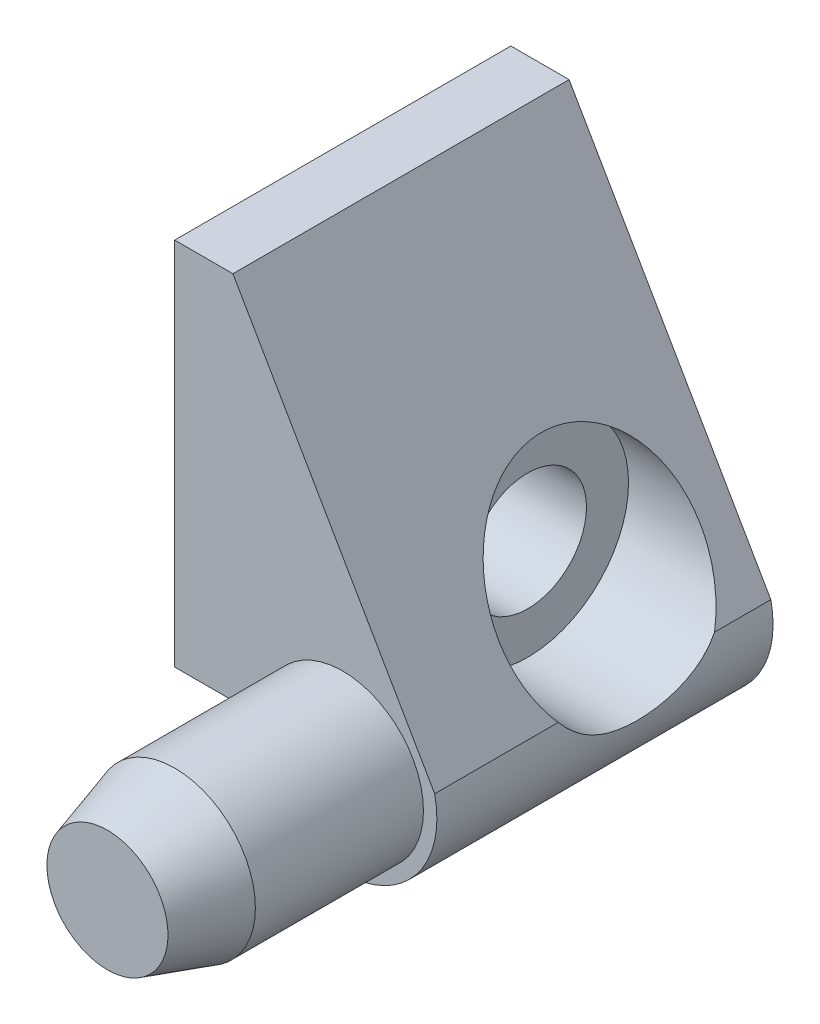
ISO-10303-21;
HEADER;
FILE_DESCRIPTION(('STEP AP214'),'2;1');
FILE_NAME('part.step','',(''),(''),'','','');
FILE_SCHEMA(('AUTOMOTIVE_DESIGN { 1 0 10303 214 1 1 1 1 }'));
ENDSEC;
DATA;
#1=APPLICATION_CONTEXT('core data for automotive mechanical design processes');
#2=APPLICATION_PROTOCOL_DEFINITION('international standard','automotive_design',2000,#1);
#3=PRODUCT_CONTEXT('',#1,'mechanical');
#4=PRODUCT('Part','Part','',(#3));
#5=PRODUCT_RELATED_PRODUCT_CATEGORY('part','',(#4));
#6=PRODUCT_DEFINITION_FORMATION('','',#4);
#7=PRODUCT_DEFINITION_CONTEXT('part definition',#1,'design');
#8=PRODUCT_DEFINITION('design','',#6,#7);
#9=PRODUCT_DEFINITION_SHAPE('','',#8);
#10=(LENGTH_UNIT() NAMED_UNIT(*) SI_UNIT(.MILLI.,.METRE.));
#11=(NAMED_UNIT(*) PLANE_ANGLE_UNIT() SI_UNIT($,.RADIAN.));
#12=(NAMED_UNIT(*) SI_UNIT($,.STERADIAN.) SOLID_ANGLE_UNIT());
#13=UNCERTAINTY_MEASURE_WITH_UNIT(LENGTH_MEASURE(1.E-05),#10,'distance_accuracy_value','');
#14=(GEOMETRIC_REPRESENTATION_CONTEXT(3) GLOBAL_UNCERTAINTY_ASSIGNED_CONTEXT((#13)) GLOBAL_UNIT_ASSIGNED_CONTEXT((#10,
#11,#12)) REPRESENTATION_CONTEXT('',''));
#15=CARTESIAN_POINT('',(0.,0.,0.));
#16=DIRECTION('',(0.,0.,1.));
#17=DIRECTION('',(1.,0.,0.));
#18=AXIS2_PLACEMENT_3D('',#15,#16,#17);
#19=CARTESIAN_POINT('',(0.,6.,17.));
#20=DIRECTION('',(0.,0.,1.));
#21=DIRECTION('',(1.,0.,0.));
#22=AXIS2_PLACEMENT_3D('',#19,#20,#21);
#23=PLANE('',#22);
#24=CARTESIAN_POINT('',(0.,6.,16.9999999999391));
#25=DIRECTION('',(0.,0.,-1.));
#26=DIRECTION('',(-1.,0.,0.));
#27=AXIS2_PLACEMENT_3D('',#24,#25,#26);
#28=CIRCLE('',#27,1.80000000000859);
#29=CARTESIAN_POINT('',(-1.80000000000859,6.,16.9999999999391));
#30=VERTEX_POINT('',#29);
#31=EDGE_CURVE('E19',#30,#30,#28,.T.);
#32=ORIENTED_EDGE('',*,*,#31,.F.);
#33=EDGE_LOOP('',(#32));
#34=FACE_BOUND('',#33,.T.);
#35=ADVANCED_FACE('F16',(#34),#23,.T.);
#36=CARTESIAN_POINT('',(0.,6.,15.0000000001569));
#37=DIRECTION('',(0.,0.,-1.));
#38=DIRECTION('',(-1.,0.,0.));
#39=AXIS2_PLACEMENT_3D('',#36,#37,#38);
#40=CONICAL_SURFACE('',#39,2.39999999996598,0.291456794488297);
#41=ORIENTED_EDGE('',*,*,#31,.T.);
#42=EDGE_LOOP('',(#41));
#43=FACE_BOUND('',#42,.T.);
#44=CARTESIAN_POINT('',(0.,6.,15.));
#45=DIRECTION('',(0.,0.,1.));
#46=DIRECTION('',(1.,0.,0.));
#47=AXIS2_PLACEMENT_3D('',#44,#45,#46);
#48=CIRCLE('',#47,2.4);
#49=CARTESIAN_POINT('',(2.4,6.,15.));
#50=VERTEX_POINT('',#49);
#51=EDGE_CURVE('E117',#50,#50,#48,.F.);
#52=ORIENTED_EDGE('',*,*,#51,.F.);
#53=EDGE_LOOP('',(#52));
#54=FACE_BOUND('',#53,.T.);
#55=ADVANCED_FACE('F188',(#43,#54),#40,.T.);
#56=CARTESIAN_POINT('',(0.,6.,0.));
#57=DIRECTION('',(0.,0.,1.));
#58=DIRECTION('',(1.,0.,0.));
#59=AXIS2_PLACEMENT_3D('',#56,#57,#58);
#60=CYLINDRICAL_SURFACE('',#59,2.4);
#61=CARTESIAN_POINT('',(0.,6.,10.));
#62=DIRECTION('',(0.,0.,1.));
#63=DIRECTION('',(1.,0.,0.));
#64=AXIS2_PLACEMENT_3D('',#61,#62,#63);
#65=CIRCLE('',#64,2.4);
#66=CARTESIAN_POINT('',(2.4,6.,10.));
#67=VERTEX_POINT('',#66);
#68=EDGE_CURVE('E84',#67,#67,#65,.F.);
#69=ORIENTED_EDGE('',*,*,#68,.F.);
#70=EDGE_LOOP('',(#69));
#71=FACE_BOUND('',#70,.T.);
#72=ORIENTED_EDGE('',*,*,#51,.T.);
#73=EDGE_LOOP('',(#72));
#74=FACE_BOUND('',#73,.T.);
#75=ADVANCED_FACE('F182',(#71,#74),#60,.T.);
#76=CARTESIAN_POINT('',(-0.5,8.5,4.));
#77=DIRECTION('',(1.,0.,0.));
#78=DIRECTION('',(0.,0.,-1.));
#79=AXIS2_PLACEMENT_3D('',#76,#77,#78);
#80=CYLINDRICAL_SURFACE('',#79,3.);
#81=CARTESIAN_POINT('',(1.63952809568406,8.5,4.));
#82=DIRECTION('',(0.866025403784329,0.50000000000019,0.));
#83=DIRECTION('',(0.50000000000019,-0.866025403784329,0.));
#84=AXIS2_PLACEMENT_3D('',#81,#82,#83);
#85=ELLIPSE('',#84,3.46410161513819,3.);
#86=CARTESIAN_POINT('',(2.73401258825069,6.60429725077608,6.32514754082077));
#87=VERTEX_POINT('',#86);
#88=CARTESIAN_POINT('',(2.73401258824931,6.60429725077507,1.67485245917938));
#89=VERTEX_POINT('',#88);
#90=EDGE_CURVE('E91',#87,#89,#85,.F.);
#91=ORIENTED_EDGE('',*,*,#90,.F.);
#92=CARTESIAN_POINT('',(2.73401258824928,6.60429725077522,1.67485245917993));
#93=CARTESIAN_POINT('',(2.74681042953276,6.54640803675654,1.72202460966673));
#94=CARTESIAN_POINT('',(2.75734058143582,6.4900324292453,1.77160941115177));
#95=CARTESIAN_POINT('',(2.77451837755256,6.38090757315318,1.87513162422298));
#96=CARTESIAN_POINT('',(2.7811702901315,6.32815439440125,1.92906417597653));
#97=CARTESIAN_POINT('',(2.79125439620791,6.22689796400339,2.0407447051854));
#98=CARTESIAN_POINT('',(2.79469633594473,6.17838225567415,2.0984805595592));
#99=CARTESIAN_POINT('',(2.79906941936379,6.08578564295933,2.21751424127087));
#100=CARTESIAN_POINT('',(2.79999976794688,6.04170614720444,2.27881319031227));
#101=CARTESIAN_POINT('',(2.80000025852538,5.9535360798114,2.41173463562039));
#102=CARTESIAN_POINT('',(2.79884608356223,5.9100178905698,2.48373708817304));
#103=CARTESIAN_POINT('',(2.79507817595348,5.82919219288486,2.63111309691236));
#104=CARTESIAN_POINT('',(2.79246426388096,5.7918854486674,2.70648706646882));
#105=CARTESIAN_POINT('',(2.78654775150598,5.7237335726848,2.86008627944494));
#106=CARTESIAN_POINT('',(2.78324508199233,5.69288909091809,2.93831180875697));
#107=CARTESIAN_POINT('',(2.77662307394283,5.63788292801322,3.09703705249922));
#108=CARTESIAN_POINT('',(2.77330374133844,5.61371901982641,3.17753599917188));
#109=CARTESIAN_POINT('',(2.76573410833707,5.56215970461323,3.37980593971775));
#110=CARTESIAN_POINT('',(2.76181278371135,5.53887837256227,3.50266325373585));
#111=CARTESIAN_POINT('',(2.75644595655566,5.50780086626357,3.75036156877828));
#112=CARTESIAN_POINT('',(2.75500006495681,5.50000225853359,3.87520225495831));
#113=CARTESIAN_POINT('',(2.75499236138822,5.49999847797247,4.08410129668731));
#114=CARTESIAN_POINT('',(2.75564381041145,5.50353760751131,4.16818309198943));
#115=CARTESIAN_POINT('',(2.75815273642384,5.51766331054382,4.335762873893));
#116=CARTESIAN_POINT('',(2.76001049222618,5.52825151330113,4.41926072101601));
#117=CARTESIAN_POINT('',(2.76467422927549,5.55640225308207,4.58506937281237));
#118=CARTESIAN_POINT('',(2.76748049139668,5.57396685624601,4.66737981833249));
#119=CARTESIAN_POINT('',(2.77361580844048,5.61593944736781,4.83022201140518));
#120=CARTESIAN_POINT('',(2.77694495647779,5.64034865481117,4.91075343923399));
#121=CARTESIAN_POINT('',(2.78517502579409,5.70925759314523,5.10783331500424));
#122=CARTESIAN_POINT('',(2.79005896510149,5.75776771753777,5.22300372339626));
#123=CARTESIAN_POINT('',(2.79747043539564,5.86871489127797,5.44632407659422));
#124=CARTESIAN_POINT('',(2.80000150602211,5.93113084484027,5.55448433860976));
#125=CARTESIAN_POINT('',(2.79999908931177,6.04164502529375,5.72109699057377));
#126=CARTESIAN_POINT('',(2.79907211815018,6.08564972445132,5.78229747429839));
#127=CARTESIAN_POINT('',(2.79471356131765,6.1780959414027,5.90116487555906));
#128=CARTESIAN_POINT('',(2.79128227081889,6.22653693572313,5.95883220866252));
#129=CARTESIAN_POINT('',(2.78121562001939,6.32778004046007,6.07054771198338));
#130=CARTESIAN_POINT('',(2.77456127588989,6.38060643373949,6.12457225067714));
#131=CARTESIAN_POINT('',(2.75736917178326,6.48987937965283,6.22825586959284));
#132=CARTESIAN_POINT('',(2.74682785308771,6.5463292104838,6.27791089754525));
#133=CARTESIAN_POINT('',(2.73401258824925,6.60429725077536,6.32514754082018));
#134=B_SPLINE_CURVE_WITH_KNOTS('',3,(#92,#93,#94,#95,#96,#97,#98,#99,#100,#101,#102,#103,#104,
#105,#106,#107,#108,#109,#110,#111,#112,#113,#114,#115,#116,#117,#118,#119,#120,#121,#122,#123,
#124,#125,#126,#127,#128,#129,#130,#131,#132,#133),.UNSPECIFIED.,.F.,.F.,(4,2,2,2,2,2,2,2,2,2,2,
2,2,2,2,2,2,2,2,2,4),(0.,0.227151690777444,0.454052905613717,0.680262929941868,
0.906544557610524,1.15864004455807,1.41076652522106,1.66291835354309,1.91498602241941,
2.28927403107693,2.66350320671926,2.91569653696918,3.16794817731616,3.42027458062707,
3.67264596887834,4.04683514921837,4.42046048653894,4.6463908988829,4.87229468618529,
5.09954553550026,5.32700496296457),.UNSPECIFIED.);
#135=EDGE_CURVE('E85',#89,#87,#134,.T.);
#136=ORIENTED_EDGE('',*,*,#135,.F.);
#137=EDGE_LOOP('',(#91,#136));
#138=FACE_BOUND('',#137,.T.);
#139=CARTESIAN_POINT('',(-0.499999999999999,8.5,4.));
#140=DIRECTION('',(1.,0.,0.));
#141=DIRECTION('',(0.,0.,-1.));
#142=AXIS2_PLACEMENT_3D('',#139,#140,#141);
#143=CIRCLE('',#142,3.);
#144=CARTESIAN_POINT('',(-0.5,8.5,1.));
#145=VERTEX_POINT('',#144);
#146=EDGE_CURVE('E90',#145,#145,#143,.T.);
#147=ORIENTED_EDGE('',*,*,#146,.F.);
#148=EDGE_LOOP('',(#147));
#149=FACE_BOUND('',#148,.T.);
#150=ADVANCED_FACE('F132',(#138,#149),#80,.F.);
#151=CARTESIAN_POINT('',(0.,6.,0.));
#152=DIRECTION('',(0.,0.,1.));
#153=DIRECTION('',(1.,0.,0.));
#154=AXIS2_PLACEMENT_3D('',#151,#152,#153);
#155=CYLINDRICAL_SURFACE('',#154,2.8);
#156=CARTESIAN_POINT('',(0.,6.,10.));
#157=DIRECTION('',(0.,0.,1.));
#158=DIRECTION('',(1.,0.,0.));
#159=AXIS2_PLACEMENT_3D('',#156,#157,#158);
#160=CIRCLE('',#159,2.8);
#161=CARTESIAN_POINT('',(2.73401258825083,6.60429725077545,10.));
#162=VERTEX_POINT('',#161);
#163=CARTESIAN_POINT('',(-2.8,6.,10.));
#164=VERTEX_POINT('',#163);
#165=EDGE_CURVE('E77',#162,#164,#160,.F.);
#166=ORIENTED_EDGE('',*,*,#165,.T.);
#167=DIRECTION('',(0.,0.,1.));
#168=VECTOR('',#167,1.);
#169=CARTESIAN_POINT('',(-2.8,6.,0.));
#170=LINE('',#169,#168);
#171=CARTESIAN_POINT('',(-2.8,6.,0.));
#172=VERTEX_POINT('',#171);
#173=EDGE_CURVE('E94',#164,#172,#170,.F.);
#174=ORIENTED_EDGE('',*,*,#173,.T.);
#175=CARTESIAN_POINT('',(0.,6.,0.));
#176=DIRECTION('',(0.,0.,1.));
#177=DIRECTION('',(1.,0.,0.));
#178=AXIS2_PLACEMENT_3D('',#175,#176,#177);
#179=CIRCLE('',#178,2.8);
#180=CARTESIAN_POINT('',(2.73401258824942,6.60429725077458,0.));
#181=VERTEX_POINT('',#180);
#182=EDGE_CURVE('E120',#172,#181,#179,.T.);
#183=ORIENTED_EDGE('',*,*,#182,.T.);
#184=DIRECTION('',(0.,0.,1.));
#185=VECTOR('',#184,1.);
#186=CARTESIAN_POINT('',(2.73401258824931,6.60429725077507,0.));
#187=LINE('',#186,#185);
#188=EDGE_CURVE('E121',#181,#89,#187,.T.);
#189=ORIENTED_EDGE('',*,*,#188,.T.);
#190=ORIENTED_EDGE('',*,*,#135,.T.);
#191=DIRECTION('',(0.,0.,1.));
#192=VECTOR('',#191,1.);
#193=CARTESIAN_POINT('',(2.73401258825214,6.60429725077681,-1.));
#194=LINE('',#193,#192);
#195=EDGE_CURVE('E70',#162,#87,#194,.F.);
#196=ORIENTED_EDGE('',*,*,#195,.F.);
#197=EDGE_LOOP('',(#166,#174,#183,#189,#190,#196));
#198=FACE_BOUND('',#197,.T.);
#199=ADVANCED_FACE('F87',(#198),#155,.T.);
#200=CARTESIAN_POINT('',(-5.,20.,-1.));
#201=DIRECTION('',(0.866025403784329,0.50000000000019,0.));
#202=DIRECTION('',(-0.50000000000019,0.866025403784329,0.));
#203=AXIS2_PLACEMENT_3D('',#200,#201,#202);
#204=PLANE('',#203);
#205=DIRECTION('',(-0.500000000000008,0.866025403784434,0.));
#206=VECTOR('',#205,1.);
#207=CARTESIAN_POINT('',(1.890343064733,8.065575730303,10.));
#208=LINE('',#207,#206);
#209=CARTESIAN_POINT('',(-3.267949192431,17.,10.));
#210=VERTEX_POINT('',#209);
#211=EDGE_CURVE('E65',#162,#210,#208,.T.);
#212=ORIENTED_EDGE('',*,*,#211,.F.);
#213=ORIENTED_EDGE('',*,*,#195,.T.);
#214=ORIENTED_EDGE('',*,*,#90,.T.);
#215=ORIENTED_EDGE('',*,*,#188,.F.);
#216=DIRECTION('',(-0.500000000000008,0.866025403784434,0.));
#217=VECTOR('',#216,1.);
#218=CARTESIAN_POINT('',(1.890343064733,8.065575730303,0.));
#219=LINE('',#218,#217);
#220=CARTESIAN_POINT('',(-3.267949192431,17.,0.));
#221=VERTEX_POINT('',#220);
#222=EDGE_CURVE('E114',#181,#221,#219,.T.);
#223=ORIENTED_EDGE('',*,*,#222,.T.);
#224=DIRECTION('',(0.,0.,1.));
#225=VECTOR('',#224,1.);
#226=CARTESIAN_POINT('',(-3.267949192431,17.,0.));
#227=LINE('',#226,#225);
#228=EDGE_CURVE('E72',#210,#221,#227,.F.);
#229=ORIENTED_EDGE('',*,*,#228,.F.);
#230=EDGE_LOOP('',(#212,#213,#214,#215,#223,#229));
#231=FACE_BOUND('',#230,.T.);
#232=ADVANCED_FACE('F67',(#231),#204,.T.);
#233=CARTESIAN_POINT('',(-0.5,8.5,4.));
#234=DIRECTION('',(1.,0.,0.));
#235=DIRECTION('',(0.,0.,-1.));
#236=AXIS2_PLACEMENT_3D('',#233,#234,#235);
#237=PLANE('',#236);
#238=CARTESIAN_POINT('',(-0.5,8.5,4.));
#239=DIRECTION('',(1.,0.,0.));
#240=DIRECTION('',(0.,0.,-1.));
#241=AXIS2_PLACEMENT_3D('',#238,#239,#240);
#242=CIRCLE('',#241,1.75);
#243=CARTESIAN_POINT('',(-0.500000000000001,8.5,2.25));
#244=VERTEX_POINT('',#243);
#245=EDGE_CURVE('E73',#244,#244,#242,.F.);
#246=ORIENTED_EDGE('',*,*,#245,.T.);
#247=EDGE_LOOP('',(#246));
#248=FACE_BOUND('',#247,.T.);
#249=ORIENTED_EDGE('',*,*,#146,.T.);
#250=EDGE_LOOP('',(#249));
#251=FACE_BOUND('',#250,.T.);
#252=ADVANCED_FACE('F140',(#248,#251),#237,.T.);
#253=CARTESIAN_POINT('',(-5.,6.,0.));
#254=DIRECTION('',(0.,1.,0.));
#255=DIRECTION('',(0.,0.,1.));
#256=AXIS2_PLACEMENT_3D('',#253,#254,#255);
#257=PLANE('',#256);
#258=DIRECTION('',(1.,0.,0.));
#259=VECTOR('',#258,1.);
#260=CARTESIAN_POINT('',(-5.,6.,10.));
#261=LINE('',#260,#259);
#262=CARTESIAN_POINT('',(-5.,6.,10.));
#263=VERTEX_POINT('',#262);
#264=EDGE_CURVE('E74',#263,#164,#261,.T.);
#265=ORIENTED_EDGE('',*,*,#264,.F.);
#266=DIRECTION('',(0.,0.,-1.));
#267=VECTOR('',#266,1.);
#268=CARTESIAN_POINT('',(-5.,6.,0.));
#269=LINE('',#268,#267);
#270=CARTESIAN_POINT('',(-5.,6.,0.));
#271=VERTEX_POINT('',#270);
#272=EDGE_CURVE('E103',#263,#271,#269,.T.);
#273=ORIENTED_EDGE('',*,*,#272,.T.);
#274=DIRECTION('',(1.,0.,0.));
#275=VECTOR('',#274,1.);
#276=CARTESIAN_POINT('',(-5.,6.,0.));
#277=LINE('',#276,#275);
#278=EDGE_CURVE('E99',#271,#172,#277,.T.);
#279=ORIENTED_EDGE('',*,*,#278,.T.);
#280=ORIENTED_EDGE('',*,*,#173,.F.);
#281=EDGE_LOOP('',(#265,#273,#279,#280));
#282=FACE_BOUND('',#281,.T.);
#283=ADVANCED_FACE('F143',(#282),#257,.F.);
#284=CARTESIAN_POINT('',(-5.,6.,0.));
#285=DIRECTION('',(0.,0.,1.));
#286=DIRECTION('',(1.,0.,0.));
#287=AXIS2_PLACEMENT_3D('',#284,#285,#286);
#288=PLANE('',#287);
#289=ORIENTED_EDGE('',*,*,#182,.F.);
#290=ORIENTED_EDGE('',*,*,#278,.F.);
#291=DIRECTION('',(0.,1.,0.));
#292=VECTOR('',#291,1.);
#293=CARTESIAN_POINT('',(-5.,6.,0.));
#294=LINE('',#293,#292);
#295=CARTESIAN_POINT('',(-5.,17.,0.));
#296=VERTEX_POINT('',#295);
#297=EDGE_CURVE('E106',#271,#296,#294,.T.);
#298=ORIENTED_EDGE('',*,*,#297,.T.);
#299=DIRECTION('',(1.,0.,0.));
#300=VECTOR('',#299,1.);
#301=CARTESIAN_POINT('',(-5.,17.,0.));
#302=LINE('',#301,#300);
#303=EDGE_CURVE('E110',#221,#296,#302,.F.);
#304=ORIENTED_EDGE('',*,*,#303,.F.);
#305=ORIENTED_EDGE('',*,*,#222,.F.);
#306=EDGE_LOOP('',(#289,#290,#298,#304,#305));
#307=FACE_BOUND('',#306,.T.);
#308=ADVANCED_FACE('F147',(#307),#288,.F.);
#309=CARTESIAN_POINT('',(-5.,17.,0.));
#310=DIRECTION('',(0.,1.,0.));
#311=DIRECTION('',(0.,0.,1.));
#312=AXIS2_PLACEMENT_3D('',#309,#310,#311);
#313=PLANE('',#312);
#314=DIRECTION('',(1.,0.,0.));
#315=VECTOR('',#314,1.);
#316=CARTESIAN_POINT('',(-5.,17.,10.));
#317=LINE('',#316,#315);
#318=CARTESIAN_POINT('',(-5.,17.,10.));
#319=VERTEX_POINT('',#318);
#320=EDGE_CURVE('E34',#210,#319,#317,.F.);
#321=ORIENTED_EDGE('',*,*,#320,.F.);
#322=ORIENTED_EDGE('',*,*,#228,.T.);
#323=ORIENTED_EDGE('',*,*,#303,.T.);
#324=DIRECTION('',(0.,0.,-1.));
#325=VECTOR('',#324,1.);
#326=CARTESIAN_POINT('',(-5.,17.,0.));
#327=LINE('',#326,#325);
#328=EDGE_CURVE('E108',#296,#319,#327,.F.);
#329=ORIENTED_EDGE('',*,*,#328,.T.);
#330=EDGE_LOOP('',(#321,#322,#323,#329));
#331=FACE_BOUND('',#330,.T.);
#332=ADVANCED_FACE('F151',(#331),#313,.T.);
#333=CARTESIAN_POINT('',(-5.,6.,10.));
#334=DIRECTION('',(0.,0.,1.));
#335=DIRECTION('',(1.,0.,0.));
#336=AXIS2_PLACEMENT_3D('',#333,#334,#335);
#337=PLANE('',#336);
#338=ORIENTED_EDGE('',*,*,#264,.T.);
#339=ORIENTED_EDGE('',*,*,#165,.F.);
#340=ORIENTED_EDGE('',*,*,#211,.T.);
#341=ORIENTED_EDGE('',*,*,#320,.T.);
#342=DIRECTION('',(0.,1.,0.));
#343=VECTOR('',#342,1.);
#344=CARTESIAN_POINT('',(-5.,6.,10.));
#345=LINE('',#344,#343);
#346=EDGE_CURVE('E25',#319,#263,#345,.F.);
#347=ORIENTED_EDGE('',*,*,#346,.T.);
#348=EDGE_LOOP('',(#338,#339,#340,#341,#347));
#349=FACE_BOUND('',#348,.T.);
#350=ORIENTED_EDGE('',*,*,#68,.T.);
#351=EDGE_LOOP('',(#350));
#352=FACE_BOUND('',#351,.T.);
#353=ADVANCED_FACE('F78',(#349,#352),#337,.T.);
#354=CARTESIAN_POINT('',(-12.,8.5,4.));
#355=DIRECTION('',(1.,0.,0.));
#356=DIRECTION('',(0.,0.,-1.));
#357=AXIS2_PLACEMENT_3D('',#354,#355,#356);
#358=CYLINDRICAL_SURFACE('',#357,1.75);
#359=ORIENTED_EDGE('',*,*,#245,.F.);
#360=EDGE_LOOP('',(#359));
#361=FACE_BOUND('',#360,.T.);
#362=CARTESIAN_POINT('',(-5.,8.5,4.));
#363=DIRECTION('',(1.,0.,0.));
#364=DIRECTION('',(0.,0.,-1.));
#365=AXIS2_PLACEMENT_3D('',#362,#363,#364);
#366=CIRCLE('',#365,1.75);
#367=CARTESIAN_POINT('',(-5.,8.5,2.25));
#368=VERTEX_POINT('',#367);
#369=EDGE_CURVE('E11',#368,#368,#366,.F.);
#370=ORIENTED_EDGE('',*,*,#369,.T.);
#371=EDGE_LOOP('',(#370));
#372=FACE_BOUND('',#371,.T.);
#373=ADVANCED_FACE('F158',(#361,#372),#358,.F.);
#374=CARTESIAN_POINT('',(-5.,6.,0.));
#375=DIRECTION('',(1.,0.,0.));
#376=DIRECTION('',(0.,0.,-1.));
#377=AXIS2_PLACEMENT_3D('',#374,#375,#376);
#378=PLANE('',#377);
#379=ORIENTED_EDGE('',*,*,#369,.F.);
#380=EDGE_LOOP('',(#379));
#381=FACE_BOUND('',#380,.T.);
#382=ORIENTED_EDGE('',*,*,#328,.F.);
#383=ORIENTED_EDGE('',*,*,#297,.F.);
#384=ORIENTED_EDGE('',*,*,#272,.F.);
#385=ORIENTED_EDGE('',*,*,#346,.F.);
#386=EDGE_LOOP('',(#382,#383,#384,#385));
#387=FACE_BOUND('',#386,.T.);
#388=ADVANCED_FACE('F161',(#381,#387),#378,.F.);
#389=CLOSED_SHELL('',(#35,#55,#75,#150,#199,#232,#252,#283,#308,#332,#353,#373,#388));
#390=MANIFOLD_SOLID_BREP('B1',#389);
#391=ADVANCED_BREP_SHAPE_REPRESENTATION('',(#18,#390),#14);
#392=SHAPE_DEFINITION_REPRESENTATION(#9,#391);
ENDSEC;
END-ISO-10303-21;
